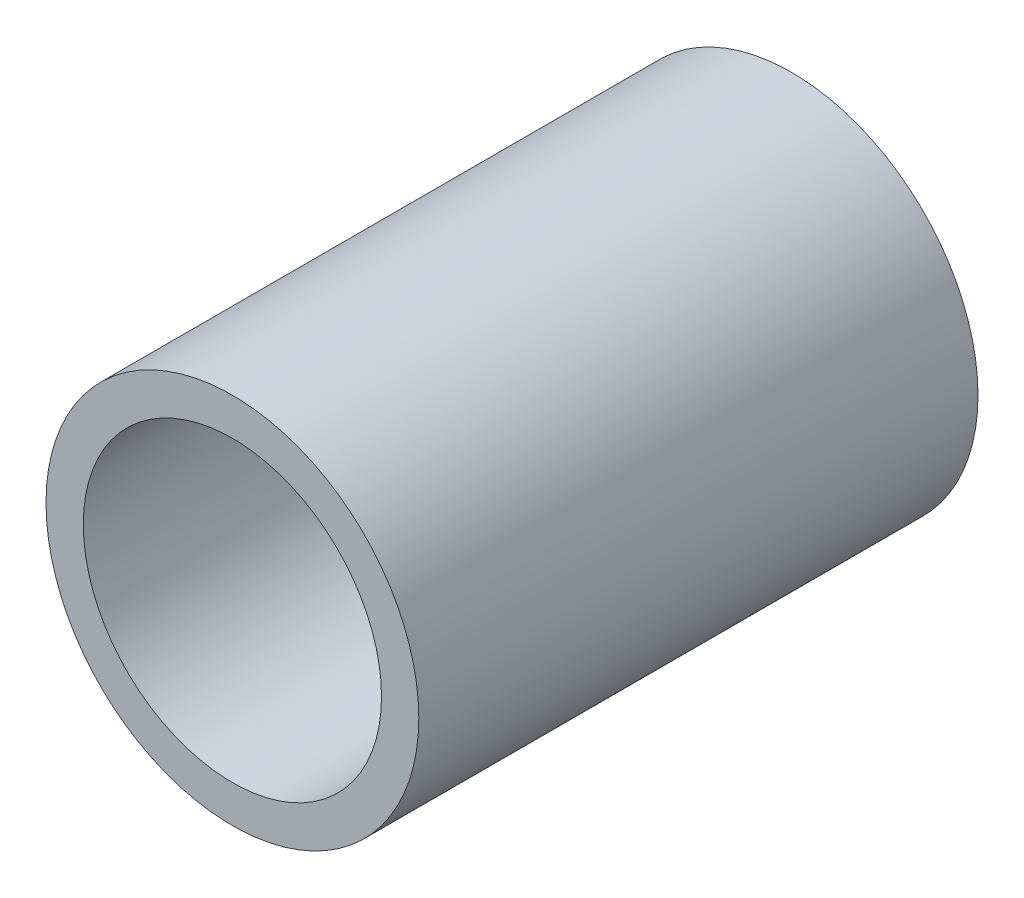
ISO-10303-21;
HEADER;
FILE_DESCRIPTION(('STEP AP214'),'2;1');
FILE_NAME('part.step','',(''),(''),'','','');
FILE_SCHEMA(('AUTOMOTIVE_DESIGN { 1 0 10303 214 1 1 1 1 }'));
ENDSEC;
DATA;
#1=APPLICATION_CONTEXT('core data for automotive mechanical design processes');
#2=APPLICATION_PROTOCOL_DEFINITION('international standard','automotive_design',2000,#1);
#3=PRODUCT_CONTEXT('',#1,'mechanical');
#4=PRODUCT('Part','Part','',(#3));
#5=PRODUCT_RELATED_PRODUCT_CATEGORY('part','',(#4));
#6=PRODUCT_DEFINITION_FORMATION('','',#4);
#7=PRODUCT_DEFINITION_CONTEXT('part definition',#1,'design');
#8=PRODUCT_DEFINITION('design','',#6,#7);
#9=PRODUCT_DEFINITION_SHAPE('','',#8);
#10=(LENGTH_UNIT() NAMED_UNIT(*) SI_UNIT(.MILLI.,.METRE.));
#11=(NAMED_UNIT(*) PLANE_ANGLE_UNIT() SI_UNIT($,.RADIAN.));
#12=(NAMED_UNIT(*) SI_UNIT($,.STERADIAN.) SOLID_ANGLE_UNIT());
#13=UNCERTAINTY_MEASURE_WITH_UNIT(LENGTH_MEASURE(1.E-05),#10,'distance_accuracy_value','');
#14=(GEOMETRIC_REPRESENTATION_CONTEXT(3) GLOBAL_UNCERTAINTY_ASSIGNED_CONTEXT((#13)) GLOBAL_UNIT_ASSIGNED_CONTEXT((#10,
#11,#12)) REPRESENTATION_CONTEXT('',''));
#15=CARTESIAN_POINT('',(0.,0.,0.));
#16=DIRECTION('',(0.,0.,1.));
#17=DIRECTION('',(1.,0.,0.));
#18=AXIS2_PLACEMENT_3D('',#15,#16,#17);
#19=CARTESIAN_POINT('',(0.,0.,15.));
#20=DIRECTION('',(0.,0.,1.));
#21=DIRECTION('',(1.,0.,0.));
#22=AXIS2_PLACEMENT_3D('',#19,#20,#21);
#23=PLANE('',#22);
#24=CARTESIAN_POINT('',(0.,0.,15.));
#25=DIRECTION('',(0.,0.,1.));
#26=DIRECTION('',(1.,0.,0.));
#27=AXIS2_PLACEMENT_3D('',#24,#25,#26);
#28=CIRCLE('',#27,5.);
#29=CARTESIAN_POINT('',(5.,0.,15.));
#30=VERTEX_POINT('',#29);
#31=EDGE_CURVE('E10',#30,#30,#28,.T.);
#32=ORIENTED_EDGE('',*,*,#31,.T.);
#33=EDGE_LOOP('',(#32));
#34=FACE_BOUND('',#33,.T.);
#35=CARTESIAN_POINT('',(0.,0.,15.));
#36=DIRECTION('',(0.,0.,1.));
#37=DIRECTION('',(1.,0.,0.));
#38=AXIS2_PLACEMENT_3D('',#35,#36,#37);
#39=CIRCLE('',#38,4.);
#40=CARTESIAN_POINT('',(4.,0.,15.));
#41=VERTEX_POINT('',#40);
#42=EDGE_CURVE('E62',#41,#41,#39,.T.);
#43=ORIENTED_EDGE('',*,*,#42,.F.);
#44=EDGE_LOOP('',(#43));
#45=FACE_BOUND('',#44,.T.);
#46=ADVANCED_FACE('F47',(#34,#45),#23,.T.);
#47=CARTESIAN_POINT('',(0.,0.,0.));
#48=DIRECTION('',(0.,0.,1.));
#49=DIRECTION('',(1.,0.,0.));
#50=AXIS2_PLACEMENT_3D('',#47,#48,#49);
#51=PLANE('',#50);
#52=CARTESIAN_POINT('',(0.,0.,0.));
#53=DIRECTION('',(0.,0.,1.));
#54=DIRECTION('',(1.,0.,0.));
#55=AXIS2_PLACEMENT_3D('',#52,#53,#54);
#56=CIRCLE('',#55,5.);
#57=CARTESIAN_POINT('',(5.,0.,0.));
#58=VERTEX_POINT('',#57);
#59=EDGE_CURVE('E51',#58,#58,#56,.T.);
#60=ORIENTED_EDGE('',*,*,#59,.F.);
#61=EDGE_LOOP('',(#60));
#62=FACE_BOUND('',#61,.T.);
#63=CARTESIAN_POINT('',(0.,0.,0.));
#64=DIRECTION('',(0.,0.,1.));
#65=DIRECTION('',(1.,0.,0.));
#66=AXIS2_PLACEMENT_3D('',#63,#64,#65);
#67=CIRCLE('',#66,4.);
#68=CARTESIAN_POINT('',(4.,0.,0.));
#69=VERTEX_POINT('',#68);
#70=EDGE_CURVE('E64',#69,#69,#67,.T.);
#71=ORIENTED_EDGE('',*,*,#70,.T.);
#72=EDGE_LOOP('',(#71));
#73=FACE_BOUND('',#72,.T.);
#74=ADVANCED_FACE('F77',(#62,#73),#51,.F.);
#75=CARTESIAN_POINT('',(0.,0.,15.));
#76=DIRECTION('',(0.,0.,-1.));
#77=DIRECTION('',(-1.,0.,0.));
#78=AXIS2_PLACEMENT_3D('',#75,#76,#77);
#79=CYLINDRICAL_SURFACE('',#78,5.);
#80=ORIENTED_EDGE('',*,*,#31,.F.);
#81=EDGE_LOOP('',(#80));
#82=FACE_BOUND('',#81,.T.);
#83=ORIENTED_EDGE('',*,*,#59,.T.);
#84=EDGE_LOOP('',(#83));
#85=FACE_BOUND('',#84,.T.);
#86=ADVANCED_FACE('F49',(#82,#85),#79,.T.);
#87=CARTESIAN_POINT('',(0.,0.,15.));
#88=DIRECTION('',(0.,0.,-1.));
#89=DIRECTION('',(-1.,0.,0.));
#90=AXIS2_PLACEMENT_3D('',#87,#88,#89);
#91=CYLINDRICAL_SURFACE('',#90,4.);
#92=ORIENTED_EDGE('',*,*,#42,.T.);
#93=EDGE_LOOP('',(#92));
#94=FACE_BOUND('',#93,.T.);
#95=ORIENTED_EDGE('',*,*,#70,.F.);
#96=EDGE_LOOP('',(#95));
#97=FACE_BOUND('',#96,.T.);
#98=ADVANCED_FACE('F73',(#94,#97),#91,.F.);
#99=CLOSED_SHELL('',(#46,#74,#86,#98));
#100=MANIFOLD_SOLID_BREP('B2',#99);
#101=ADVANCED_BREP_SHAPE_REPRESENTATION('',(#18,#100),#14);
#102=SHAPE_DEFINITION_REPRESENTATION(#9,#101);
ENDSEC;
END-ISO-10303-21;
